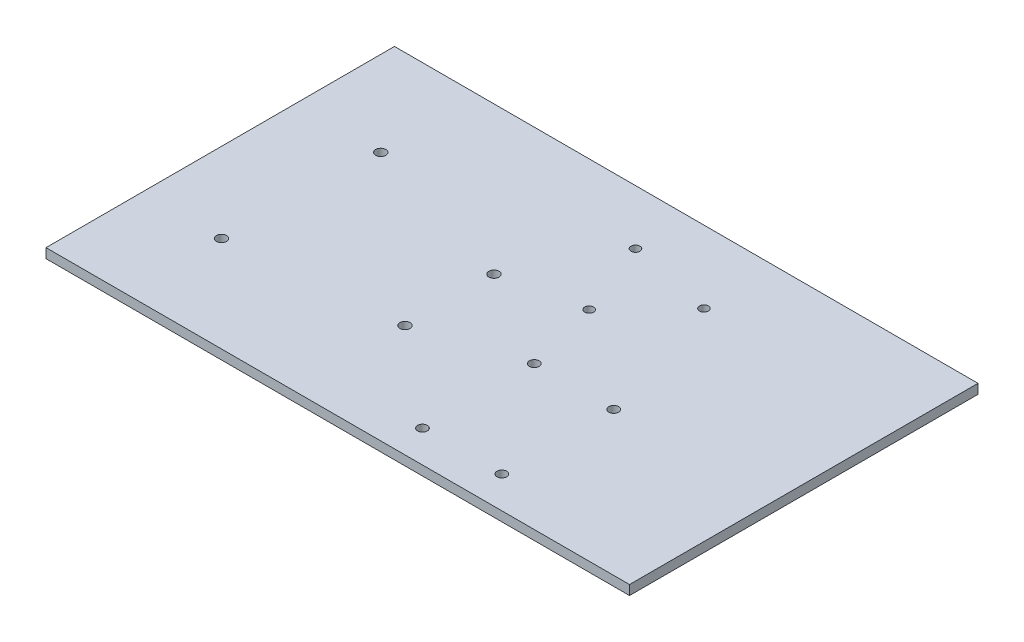
ISO-10303-21;
HEADER;
FILE_DESCRIPTION(('STEP AP214'),'2;1');
FILE_NAME('part.step','',(''),(''),'','','');
FILE_SCHEMA(('AUTOMOTIVE_DESIGN { 1 0 10303 214 1 1 1 1 }'));
ENDSEC;
DATA;
#1=APPLICATION_CONTEXT('core data for automotive mechanical design processes');
#2=APPLICATION_PROTOCOL_DEFINITION('international standard','automotive_design',2000,#1);
#3=PRODUCT_CONTEXT('',#1,'mechanical');
#4=PRODUCT('Part','Part','',(#3));
#5=PRODUCT_RELATED_PRODUCT_CATEGORY('part','',(#4));
#6=PRODUCT_DEFINITION_FORMATION('','',#4);
#7=PRODUCT_DEFINITION_CONTEXT('part definition',#1,'design');
#8=PRODUCT_DEFINITION('design','',#6,#7);
#9=PRODUCT_DEFINITION_SHAPE('','',#8);
#10=(LENGTH_UNIT() NAMED_UNIT(*) SI_UNIT(.MILLI.,.METRE.));
#11=(NAMED_UNIT(*) PLANE_ANGLE_UNIT() SI_UNIT($,.RADIAN.));
#12=(NAMED_UNIT(*) SI_UNIT($,.STERADIAN.) SOLID_ANGLE_UNIT());
#13=UNCERTAINTY_MEASURE_WITH_UNIT(LENGTH_MEASURE(1.E-05),#10,'distance_accuracy_value','');
#14=(GEOMETRIC_REPRESENTATION_CONTEXT(3) GLOBAL_UNCERTAINTY_ASSIGNED_CONTEXT((#13)) GLOBAL_UNIT_ASSIGNED_CONTEXT((#10,
#11,#12)) REPRESENTATION_CONTEXT('',''));
#15=CARTESIAN_POINT('',(0.,0.,0.));
#16=DIRECTION('',(0.,0.,1.));
#17=DIRECTION('',(1.,0.,0.));
#18=AXIS2_PLACEMENT_3D('',#15,#16,#17);
#19=CARTESIAN_POINT('',(91.44,3.,-54.61));
#20=DIRECTION('',(-1.,0.,0.));
#21=DIRECTION('',(0.,0.,1.));
#22=AXIS2_PLACEMENT_3D('',#19,#20,#21);
#23=PLANE('',#22);
#24=DIRECTION('',(0.,0.,-1.));
#25=VECTOR('',#24,1.);
#26=CARTESIAN_POINT('',(91.44,0.,-54.61));
#27=LINE('',#26,#25);
#28=CARTESIAN_POINT('',(91.44,0.,54.61));
#29=VERTEX_POINT('',#28);
#30=CARTESIAN_POINT('',(91.44,0.,-54.61));
#31=VERTEX_POINT('',#30);
#32=EDGE_CURVE('E124',#29,#31,#27,.T.);
#33=ORIENTED_EDGE('',*,*,#32,.T.);
#34=DIRECTION('',(0.,-1.,0.));
#35=VECTOR('',#34,1.);
#36=CARTESIAN_POINT('',(91.44,3.,-54.61));
#37=LINE('',#36,#35);
#38=CARTESIAN_POINT('',(91.44,3.,-54.61));
#39=VERTEX_POINT('',#38);
#40=EDGE_CURVE('E13',#39,#31,#37,.T.);
#41=ORIENTED_EDGE('',*,*,#40,.F.);
#42=DIRECTION('',(0.,0.,-1.));
#43=VECTOR('',#42,1.);
#44=CARTESIAN_POINT('',(91.44,3.,-54.61));
#45=LINE('',#44,#43);
#46=CARTESIAN_POINT('',(91.44,3.,54.61));
#47=VERTEX_POINT('',#46);
#48=EDGE_CURVE('E107',#47,#39,#45,.T.);
#49=ORIENTED_EDGE('',*,*,#48,.F.);
#50=DIRECTION('',(0.,-1.,0.));
#51=VECTOR('',#50,1.);
#52=CARTESIAN_POINT('',(91.44,3.,54.61));
#53=LINE('',#52,#51);
#54=EDGE_CURVE('E120',#47,#29,#53,.T.);
#55=ORIENTED_EDGE('',*,*,#54,.T.);
#56=EDGE_LOOP('',(#33,#41,#49,#55));
#57=FACE_BOUND('',#56,.T.);
#58=ADVANCED_FACE('F53',(#57),#23,.F.);
#59=CARTESIAN_POINT('',(-91.44,3.,-54.61));
#60=DIRECTION('',(0.,0.,1.));
#61=DIRECTION('',(1.,0.,0.));
#62=AXIS2_PLACEMENT_3D('',#59,#60,#61);
#63=PLANE('',#62);
#64=DIRECTION('',(-1.,0.,0.));
#65=VECTOR('',#64,1.);
#66=CARTESIAN_POINT('',(-91.44,0.,-54.61));
#67=LINE('',#66,#65);
#68=CARTESIAN_POINT('',(-91.44,0.,-54.61));
#69=VERTEX_POINT('',#68);
#70=EDGE_CURVE('E112',#31,#69,#67,.T.);
#71=ORIENTED_EDGE('',*,*,#70,.T.);
#72=DIRECTION('',(0.,-1.,0.));
#73=VECTOR('',#72,1.);
#74=CARTESIAN_POINT('',(-91.44,3.,-54.61));
#75=LINE('',#74,#73);
#76=CARTESIAN_POINT('',(-91.44,3.,-54.61));
#77=VERTEX_POINT('',#76);
#78=EDGE_CURVE('E63',#77,#69,#75,.T.);
#79=ORIENTED_EDGE('',*,*,#78,.F.);
#80=DIRECTION('',(-1.,0.,0.));
#81=VECTOR('',#80,1.);
#82=CARTESIAN_POINT('',(-91.44,3.,-54.61));
#83=LINE('',#82,#81);
#84=EDGE_CURVE('E102',#39,#77,#83,.T.);
#85=ORIENTED_EDGE('',*,*,#84,.F.);
#86=ORIENTED_EDGE('',*,*,#40,.T.);
#87=EDGE_LOOP('',(#71,#79,#85,#86));
#88=FACE_BOUND('',#87,.T.);
#89=ADVANCED_FACE('F111',(#88),#63,.F.);
#90=CARTESIAN_POINT('',(-91.44,3.,-54.61));
#91=DIRECTION('',(1.,0.,0.));
#92=DIRECTION('',(0.,0.,-1.));
#93=AXIS2_PLACEMENT_3D('',#90,#91,#92);
#94=PLANE('',#93);
#95=DIRECTION('',(0.,0.,1.));
#96=VECTOR('',#95,1.);
#97=CARTESIAN_POINT('',(-91.44,0.,-54.61));
#98=LINE('',#97,#96);
#99=CARTESIAN_POINT('',(-91.44,0.,54.61));
#100=VERTEX_POINT('',#99);
#101=EDGE_CURVE('E89',#69,#100,#98,.T.);
#102=ORIENTED_EDGE('',*,*,#101,.T.);
#103=DIRECTION('',(0.,-1.,0.));
#104=VECTOR('',#103,1.);
#105=CARTESIAN_POINT('',(-91.44,3.,54.61));
#106=LINE('',#105,#104);
#107=CARTESIAN_POINT('',(-91.44,3.,54.61));
#108=VERTEX_POINT('',#107);
#109=EDGE_CURVE('E114',#108,#100,#106,.T.);
#110=ORIENTED_EDGE('',*,*,#109,.F.);
#111=DIRECTION('',(0.,0.,1.));
#112=VECTOR('',#111,1.);
#113=CARTESIAN_POINT('',(-91.44,3.,-54.61));
#114=LINE('',#113,#112);
#115=EDGE_CURVE('E105',#77,#108,#114,.T.);
#116=ORIENTED_EDGE('',*,*,#115,.F.);
#117=ORIENTED_EDGE('',*,*,#78,.T.);
#118=EDGE_LOOP('',(#102,#110,#116,#117));
#119=FACE_BOUND('',#118,.T.);
#120=ADVANCED_FACE('F116',(#119),#94,.F.);
#121=CARTESIAN_POINT('',(-91.44,3.,54.61));
#122=DIRECTION('',(0.,0.,-1.));
#123=DIRECTION('',(-1.,0.,0.));
#124=AXIS2_PLACEMENT_3D('',#121,#122,#123);
#125=PLANE('',#124);
#126=DIRECTION('',(1.,0.,0.));
#127=VECTOR('',#126,1.);
#128=CARTESIAN_POINT('',(-91.44,0.,54.61));
#129=LINE('',#128,#127);
#130=EDGE_CURVE('E95',#100,#29,#129,.T.);
#131=ORIENTED_EDGE('',*,*,#130,.T.);
#132=ORIENTED_EDGE('',*,*,#54,.F.);
#133=DIRECTION('',(1.,0.,0.));
#134=VECTOR('',#133,1.);
#135=CARTESIAN_POINT('',(-91.44,3.,54.61));
#136=LINE('',#135,#134);
#137=EDGE_CURVE('E72',#108,#47,#136,.T.);
#138=ORIENTED_EDGE('',*,*,#137,.F.);
#139=ORIENTED_EDGE('',*,*,#109,.T.);
#140=EDGE_LOOP('',(#131,#132,#138,#139));
#141=FACE_BOUND('',#140,.T.);
#142=ADVANCED_FACE('F191',(#141),#125,.F.);
#143=CARTESIAN_POINT('',(0.,3.,0.));
#144=DIRECTION('',(0.,1.,0.));
#145=DIRECTION('',(0.,0.,1.));
#146=AXIS2_PLACEMENT_3D('',#143,#144,#145);
#147=PLANE('',#146);
#148=CARTESIAN_POINT('',(41.44,3.,44.61));
#149=DIRECTION('',(0.,1.,0.));
#150=DIRECTION('',(0.,0.,1.));
#151=AXIS2_PLACEMENT_3D('',#148,#149,#150);
#152=CIRCLE('',#151,1.52499999999999);
#153=CARTESIAN_POINT('',(41.44,3.,46.135));
#154=VERTEX_POINT('',#153);
#155=EDGE_CURVE('E347',#154,#154,#152,.T.);
#156=ORIENTED_EDGE('',*,*,#155,.F.);
#157=EDGE_LOOP('',(#156));
#158=FACE_BOUND('',#157,.T.);
#159=CARTESIAN_POINT('',(16.55,3.,9.56));
#160=DIRECTION('',(0.,1.,0.));
#161=DIRECTION('',(0.,0.,1.));
#162=AXIS2_PLACEMENT_3D('',#159,#160,#161);
#163=CIRCLE('',#162,1.525);
#164=CARTESIAN_POINT('',(16.55,3.,11.085));
#165=VERTEX_POINT('',#164);
#166=EDGE_CURVE('E351',#165,#165,#163,.T.);
#167=ORIENTED_EDGE('',*,*,#166,.F.);
#168=EDGE_LOOP('',(#167));
#169=FACE_BOUND('',#168,.T.);
#170=CARTESIAN_POINT('',(41.44,3.,9.56));
#171=DIRECTION('',(0.,1.,0.));
#172=DIRECTION('',(0.,0.,1.));
#173=AXIS2_PLACEMENT_3D('',#170,#171,#172);
#174=CIRCLE('',#173,1.52499999999998);
#175=CARTESIAN_POINT('',(41.44,3.,11.085));
#176=VERTEX_POINT('',#175);
#177=EDGE_CURVE('E410',#176,#176,#174,.T.);
#178=ORIENTED_EDGE('',*,*,#177,.F.);
#179=EDGE_LOOP('',(#178));
#180=FACE_BOUND('',#179,.T.);
#181=CARTESIAN_POINT('',(16.55,3.,44.61));
#182=DIRECTION('',(0.,1.,0.));
#183=DIRECTION('',(0.,0.,1.));
#184=AXIS2_PLACEMENT_3D('',#181,#182,#183);
#185=CIRCLE('',#184,1.525);
#186=CARTESIAN_POINT('',(16.55,3.,46.135));
#187=VERTEX_POINT('',#186);
#188=EDGE_CURVE('E360',#187,#187,#185,.T.);
#189=ORIENTED_EDGE('',*,*,#188,.F.);
#190=EDGE_LOOP('',(#189));
#191=FACE_BOUND('',#190,.T.);
#192=CARTESIAN_POINT('',(10.4954307859294,3.,-13.69));
#193=DIRECTION('',(0.,1.,0.));
#194=DIRECTION('',(0.,0.,1.));
#195=AXIS2_PLACEMENT_3D('',#192,#193,#194);
#196=CIRCLE('',#195,1.39999719999992);
#197=CARTESIAN_POINT('',(10.4954307859294,3.,-12.2900028000001));
#198=VERTEX_POINT('',#197);
#199=EDGE_CURVE('E370',#198,#198,#196,.T.);
#200=ORIENTED_EDGE('',*,*,#199,.F.);
#201=EDGE_LOOP('',(#200));
#202=FACE_BOUND('',#201,.T.);
#203=CARTESIAN_POINT('',(28.18,3.,-31.98));
#204=DIRECTION('',(0.,1.,0.));
#205=DIRECTION('',(0.,0.,1.));
#206=AXIS2_PLACEMENT_3D('',#203,#204,#205);
#207=CIRCLE('',#206,1.39999719999999);
#208=CARTESIAN_POINT('',(28.18,3.,-30.5800028));
#209=VERTEX_POINT('',#208);
#210=EDGE_CURVE('E378',#209,#209,#207,.T.);
#211=ORIENTED_EDGE('',*,*,#210,.F.);
#212=EDGE_LOOP('',(#211));
#213=FACE_BOUND('',#212,.T.);
#214=CARTESIAN_POINT('',(1.23357352078024,3.,-37.47));
#215=DIRECTION('',(0.,1.,0.));
#216=DIRECTION('',(0.,0.,1.));
#217=AXIS2_PLACEMENT_3D('',#214,#215,#216);
#218=CIRCLE('',#217,1.39999719999992);
#219=CARTESIAN_POINT('',(1.23357352078024,3.,-36.0700028000001));
#220=VERTEX_POINT('',#219);
#221=EDGE_CURVE('E359',#220,#220,#218,.T.);
#222=ORIENTED_EDGE('',*,*,#221,.F.);
#223=EDGE_LOOP('',(#222));
#224=FACE_BOUND('',#223,.T.);
#225=CARTESIAN_POINT('',(-66.44,3.,24.61));
#226=DIRECTION('',(0.,1.,0.));
#227=DIRECTION('',(0.,0.,1.));
#228=AXIS2_PLACEMENT_3D('',#225,#226,#227);
#229=CIRCLE('',#228,1.6);
#230=CARTESIAN_POINT('',(-66.44,3.,26.21));
#231=VERTEX_POINT('',#230);
#232=EDGE_CURVE('E143',#231,#231,#229,.T.);
#233=ORIENTED_EDGE('',*,*,#232,.F.);
#234=EDGE_LOOP('',(#233));
#235=FACE_BOUND('',#234,.T.);
#236=CARTESIAN_POINT('',(-64.84,3.,-23.69));
#237=DIRECTION('',(0.,1.,0.));
#238=DIRECTION('',(0.,0.,1.));
#239=AXIS2_PLACEMENT_3D('',#236,#237,#238);
#240=CIRCLE('',#239,1.6);
#241=CARTESIAN_POINT('',(-64.84,3.,-22.09));
#242=VERTEX_POINT('',#241);
#243=EDGE_CURVE('E391',#242,#242,#240,.T.);
#244=ORIENTED_EDGE('',*,*,#243,.F.);
#245=EDGE_LOOP('',(#244));
#246=FACE_BOUND('',#245,.T.);
#247=CARTESIAN_POINT('',(-14.04,3.,-8.39));
#248=DIRECTION('',(0.,1.,0.));
#249=DIRECTION('',(0.,0.,1.));
#250=AXIS2_PLACEMENT_3D('',#247,#248,#249);
#251=CIRCLE('',#250,1.6);
#252=CARTESIAN_POINT('',(-14.04,3.,-6.79));
#253=VERTEX_POINT('',#252);
#254=EDGE_CURVE('E395',#253,#253,#251,.T.);
#255=ORIENTED_EDGE('',*,*,#254,.F.);
#256=EDGE_LOOP('',(#255));
#257=FACE_BOUND('',#256,.T.);
#258=CARTESIAN_POINT('',(-14.04,3.,19.51));
#259=DIRECTION('',(0.,1.,0.));
#260=DIRECTION('',(0.,0.,1.));
#261=AXIS2_PLACEMENT_3D('',#258,#259,#260);
#262=CIRCLE('',#261,1.6);
#263=CARTESIAN_POINT('',(-14.04,3.,21.11));
#264=VERTEX_POINT('',#263);
#265=EDGE_CURVE('E369',#264,#264,#262,.T.);
#266=ORIENTED_EDGE('',*,*,#265,.F.);
#267=EDGE_LOOP('',(#266));
#268=FACE_BOUND('',#267,.T.);
#269=ORIENTED_EDGE('',*,*,#48,.T.);
#270=ORIENTED_EDGE('',*,*,#84,.T.);
#271=ORIENTED_EDGE('',*,*,#115,.T.);
#272=ORIENTED_EDGE('',*,*,#137,.T.);
#273=EDGE_LOOP('',(#269,#270,#271,#272));
#274=FACE_BOUND('',#273,.T.);
#275=ADVANCED_FACE('F103',(#158,#169,#180,#191,#202,#213,#224,#235,#246,#257,#268,#274),#147,.T.);
#276=CARTESIAN_POINT('',(0.,0.,0.));
#277=DIRECTION('',(0.,1.,0.));
#278=DIRECTION('',(0.,0.,1.));
#279=AXIS2_PLACEMENT_3D('',#276,#277,#278);
#280=PLANE('',#279);
#281=CARTESIAN_POINT('',(41.44,0.,44.61));
#282=DIRECTION('',(0.,1.,0.));
#283=DIRECTION('',(0.,0.,1.));
#284=AXIS2_PLACEMENT_3D('',#281,#282,#283);
#285=CIRCLE('',#284,1.52499999999999);
#286=CARTESIAN_POINT('',(41.44,0.,46.135));
#287=VERTEX_POINT('',#286);
#288=EDGE_CURVE('E344',#287,#287,#285,.T.);
#289=ORIENTED_EDGE('',*,*,#288,.T.);
#290=EDGE_LOOP('',(#289));
#291=FACE_BOUND('',#290,.T.);
#292=CARTESIAN_POINT('',(16.55,0.,9.56));
#293=DIRECTION('',(0.,1.,0.));
#294=DIRECTION('',(0.,0.,1.));
#295=AXIS2_PLACEMENT_3D('',#292,#293,#294);
#296=CIRCLE('',#295,1.525);
#297=CARTESIAN_POINT('',(16.55,0.,11.085));
#298=VERTEX_POINT('',#297);
#299=EDGE_CURVE('E414',#298,#298,#296,.T.);
#300=ORIENTED_EDGE('',*,*,#299,.T.);
#301=EDGE_LOOP('',(#300));
#302=FACE_BOUND('',#301,.T.);
#303=CARTESIAN_POINT('',(41.44,0.,9.56));
#304=DIRECTION('',(0.,1.,0.));
#305=DIRECTION('',(0.,0.,1.));
#306=AXIS2_PLACEMENT_3D('',#303,#304,#305);
#307=CIRCLE('',#306,1.52499999999998);
#308=CARTESIAN_POINT('',(41.44,0.,11.085));
#309=VERTEX_POINT('',#308);
#310=EDGE_CURVE('E364',#309,#309,#307,.T.);
#311=ORIENTED_EDGE('',*,*,#310,.T.);
#312=EDGE_LOOP('',(#311));
#313=FACE_BOUND('',#312,.T.);
#314=CARTESIAN_POINT('',(16.55,0.,44.61));
#315=DIRECTION('',(0.,1.,0.));
#316=DIRECTION('',(0.,0.,1.));
#317=AXIS2_PLACEMENT_3D('',#314,#315,#316);
#318=CIRCLE('',#317,1.525);
#319=CARTESIAN_POINT('',(16.55,0.,46.135));
#320=VERTEX_POINT('',#319);
#321=EDGE_CURVE('E355',#320,#320,#318,.T.);
#322=ORIENTED_EDGE('',*,*,#321,.T.);
#323=EDGE_LOOP('',(#322));
#324=FACE_BOUND('',#323,.T.);
#325=CARTESIAN_POINT('',(10.4954307859294,0.,-13.69));
#326=DIRECTION('',(0.,1.,0.));
#327=DIRECTION('',(0.,0.,1.));
#328=AXIS2_PLACEMENT_3D('',#325,#326,#327);
#329=CIRCLE('',#328,1.39999719999992);
#330=CARTESIAN_POINT('',(10.4954307859294,0.,-12.2900028000001));
#331=VERTEX_POINT('',#330);
#332=EDGE_CURVE('E365',#331,#331,#329,.T.);
#333=ORIENTED_EDGE('',*,*,#332,.T.);
#334=EDGE_LOOP('',(#333));
#335=FACE_BOUND('',#334,.T.);
#336=CARTESIAN_POINT('',(28.18,0.,-31.98));
#337=DIRECTION('',(0.,1.,0.));
#338=DIRECTION('',(0.,0.,1.));
#339=AXIS2_PLACEMENT_3D('',#336,#337,#338);
#340=CIRCLE('',#339,1.39999719999999);
#341=CARTESIAN_POINT('',(28.18,0.,-30.5800028));
#342=VERTEX_POINT('',#341);
#343=EDGE_CURVE('E374',#342,#342,#340,.T.);
#344=ORIENTED_EDGE('',*,*,#343,.T.);
#345=EDGE_LOOP('',(#344));
#346=FACE_BOUND('',#345,.T.);
#347=CARTESIAN_POINT('',(1.23357352078024,0.,-37.47));
#348=DIRECTION('',(0.,1.,0.));
#349=DIRECTION('',(0.,0.,1.));
#350=AXIS2_PLACEMENT_3D('',#347,#348,#349);
#351=CIRCLE('',#350,1.39999719999992);
#352=CARTESIAN_POINT('',(1.23357352078024,0.,-36.0700028000001));
#353=VERTEX_POINT('',#352);
#354=EDGE_CURVE('E382',#353,#353,#351,.T.);
#355=ORIENTED_EDGE('',*,*,#354,.T.);
#356=EDGE_LOOP('',(#355));
#357=FACE_BOUND('',#356,.T.);
#358=CARTESIAN_POINT('',(-66.44,0.,24.61));
#359=DIRECTION('',(0.,1.,0.));
#360=DIRECTION('',(0.,0.,1.));
#361=AXIS2_PLACEMENT_3D('',#358,#359,#360);
#362=CIRCLE('',#361,1.6);
#363=CARTESIAN_POINT('',(-66.44,0.,26.21));
#364=VERTEX_POINT('',#363);
#365=EDGE_CURVE('E56',#364,#364,#362,.T.);
#366=ORIENTED_EDGE('',*,*,#365,.T.);
#367=EDGE_LOOP('',(#366));
#368=FACE_BOUND('',#367,.T.);
#369=CARTESIAN_POINT('',(-64.84,0.,-23.69));
#370=DIRECTION('',(0.,1.,0.));
#371=DIRECTION('',(0.,0.,1.));
#372=AXIS2_PLACEMENT_3D('',#369,#370,#371);
#373=CIRCLE('',#372,1.6);
#374=CARTESIAN_POINT('',(-64.84,0.,-22.09));
#375=VERTEX_POINT('',#374);
#376=EDGE_CURVE('E146',#375,#375,#373,.T.);
#377=ORIENTED_EDGE('',*,*,#376,.T.);
#378=EDGE_LOOP('',(#377));
#379=FACE_BOUND('',#378,.T.);
#380=CARTESIAN_POINT('',(-14.04,0.,-8.39));
#381=DIRECTION('',(0.,1.,0.));
#382=DIRECTION('',(0.,0.,1.));
#383=AXIS2_PLACEMENT_3D('',#380,#381,#382);
#384=CIRCLE('',#383,1.6);
#385=CARTESIAN_POINT('',(-14.04,0.,-6.79));
#386=VERTEX_POINT('',#385);
#387=EDGE_CURVE('E142',#386,#386,#384,.T.);
#388=ORIENTED_EDGE('',*,*,#387,.T.);
#389=EDGE_LOOP('',(#388));
#390=FACE_BOUND('',#389,.T.);
#391=CARTESIAN_POINT('',(-14.04,0.,19.51));
#392=DIRECTION('',(0.,1.,0.));
#393=DIRECTION('',(0.,0.,1.));
#394=AXIS2_PLACEMENT_3D('',#391,#392,#393);
#395=CIRCLE('',#394,1.6);
#396=CARTESIAN_POINT('',(-14.04,0.,21.11));
#397=VERTEX_POINT('',#396);
#398=EDGE_CURVE('E138',#397,#397,#395,.T.);
#399=ORIENTED_EDGE('',*,*,#398,.T.);
#400=EDGE_LOOP('',(#399));
#401=FACE_BOUND('',#400,.T.);
#402=ORIENTED_EDGE('',*,*,#32,.F.);
#403=ORIENTED_EDGE('',*,*,#130,.F.);
#404=ORIENTED_EDGE('',*,*,#101,.F.);
#405=ORIENTED_EDGE('',*,*,#70,.F.);
#406=EDGE_LOOP('',(#402,#403,#404,#405));
#407=FACE_BOUND('',#406,.T.);
#408=ADVANCED_FACE('F155',(#291,#302,#313,#324,#335,#346,#357,#368,#379,#390,#401,#407),#280,.F.);
#409=CARTESIAN_POINT('',(-14.04,-7.,19.51));
#410=DIRECTION('',(0.,1.,0.));
#411=DIRECTION('',(0.,0.,1.));
#412=AXIS2_PLACEMENT_3D('',#409,#410,#411);
#413=CYLINDRICAL_SURFACE('',#412,1.6);
#414=ORIENTED_EDGE('',*,*,#265,.T.);
#415=EDGE_LOOP('',(#414));
#416=FACE_BOUND('',#415,.T.);
#417=ORIENTED_EDGE('',*,*,#398,.F.);
#418=EDGE_LOOP('',(#417));
#419=FACE_BOUND('',#418,.T.);
#420=ADVANCED_FACE('F182',(#416,#419),#413,.F.);
#421=CARTESIAN_POINT('',(-14.04,-7.,-8.39));
#422=DIRECTION('',(0.,1.,0.));
#423=DIRECTION('',(0.,0.,1.));
#424=AXIS2_PLACEMENT_3D('',#421,#422,#423);
#425=CYLINDRICAL_SURFACE('',#424,1.6);
#426=ORIENTED_EDGE('',*,*,#254,.T.);
#427=EDGE_LOOP('',(#426));
#428=FACE_BOUND('',#427,.T.);
#429=ORIENTED_EDGE('',*,*,#387,.F.);
#430=EDGE_LOOP('',(#429));
#431=FACE_BOUND('',#430,.T.);
#432=ADVANCED_FACE('F170',(#428,#431),#425,.F.);
#433=CARTESIAN_POINT('',(-64.84,-7.,-23.69));
#434=DIRECTION('',(0.,1.,0.));
#435=DIRECTION('',(0.,0.,1.));
#436=AXIS2_PLACEMENT_3D('',#433,#434,#435);
#437=CYLINDRICAL_SURFACE('',#436,1.6);
#438=ORIENTED_EDGE('',*,*,#243,.T.);
#439=EDGE_LOOP('',(#438));
#440=FACE_BOUND('',#439,.T.);
#441=ORIENTED_EDGE('',*,*,#376,.F.);
#442=EDGE_LOOP('',(#441));
#443=FACE_BOUND('',#442,.T.);
#444=ADVANCED_FACE('F160',(#440,#443),#437,.F.);
#445=CARTESIAN_POINT('',(-66.44,-7.,24.61));
#446=DIRECTION('',(0.,1.,0.));
#447=DIRECTION('',(0.,0.,1.));
#448=AXIS2_PLACEMENT_3D('',#445,#446,#447);
#449=CYLINDRICAL_SURFACE('',#448,1.6);
#450=ORIENTED_EDGE('',*,*,#232,.T.);
#451=EDGE_LOOP('',(#450));
#452=FACE_BOUND('',#451,.T.);
#453=ORIENTED_EDGE('',*,*,#365,.F.);
#454=EDGE_LOOP('',(#453));
#455=FACE_BOUND('',#454,.T.);
#456=ADVANCED_FACE('F157',(#452,#455),#449,.F.);
#457=CARTESIAN_POINT('',(1.23357352078024,0.,-37.47));
#458=DIRECTION('',(0.,1.,0.));
#459=DIRECTION('',(0.,0.,1.));
#460=AXIS2_PLACEMENT_3D('',#457,#458,#459);
#461=CYLINDRICAL_SURFACE('',#460,1.39999719999992);
#462=ORIENTED_EDGE('',*,*,#354,.F.);
#463=EDGE_LOOP('',(#462));
#464=FACE_BOUND('',#463,.T.);
#465=ORIENTED_EDGE('',*,*,#221,.T.);
#466=EDGE_LOOP('',(#465));
#467=FACE_BOUND('',#466,.T.);
#468=ADVANCED_FACE('F159',(#464,#467),#461,.F.);
#469=CARTESIAN_POINT('',(28.18,0.,-31.98));
#470=DIRECTION('',(0.,1.,0.));
#471=DIRECTION('',(0.,0.,1.));
#472=AXIS2_PLACEMENT_3D('',#469,#470,#471);
#473=CYLINDRICAL_SURFACE('',#472,1.39999719999999);
#474=ORIENTED_EDGE('',*,*,#343,.F.);
#475=EDGE_LOOP('',(#474));
#476=FACE_BOUND('',#475,.T.);
#477=ORIENTED_EDGE('',*,*,#210,.T.);
#478=EDGE_LOOP('',(#477));
#479=FACE_BOUND('',#478,.T.);
#480=ADVANCED_FACE('F167',(#476,#479),#473,.F.);
#481=CARTESIAN_POINT('',(10.4954307859294,0.,-13.69));
#482=DIRECTION('',(0.,1.,0.));
#483=DIRECTION('',(0.,0.,1.));
#484=AXIS2_PLACEMENT_3D('',#481,#482,#483);
#485=CYLINDRICAL_SURFACE('',#484,1.39999719999992);
#486=ORIENTED_EDGE('',*,*,#332,.F.);
#487=EDGE_LOOP('',(#486));
#488=FACE_BOUND('',#487,.T.);
#489=ORIENTED_EDGE('',*,*,#199,.T.);
#490=EDGE_LOOP('',(#489));
#491=FACE_BOUND('',#490,.T.);
#492=ADVANCED_FACE('F290',(#488,#491),#485,.F.);
#493=CARTESIAN_POINT('',(16.55,0.,44.61));
#494=DIRECTION('',(0.,1.,0.));
#495=DIRECTION('',(0.,0.,1.));
#496=AXIS2_PLACEMENT_3D('',#493,#494,#495);
#497=CYLINDRICAL_SURFACE('',#496,1.525);
#498=ORIENTED_EDGE('',*,*,#321,.F.);
#499=EDGE_LOOP('',(#498));
#500=FACE_BOUND('',#499,.T.);
#501=ORIENTED_EDGE('',*,*,#188,.T.);
#502=EDGE_LOOP('',(#501));
#503=FACE_BOUND('',#502,.T.);
#504=ADVANCED_FACE('F298',(#500,#503),#497,.F.);
#505=CARTESIAN_POINT('',(41.44,0.,9.56));
#506=DIRECTION('',(0.,1.,0.));
#507=DIRECTION('',(0.,0.,1.));
#508=AXIS2_PLACEMENT_3D('',#505,#506,#507);
#509=CYLINDRICAL_SURFACE('',#508,1.52499999999998);
#510=ORIENTED_EDGE('',*,*,#310,.F.);
#511=EDGE_LOOP('',(#510));
#512=FACE_BOUND('',#511,.T.);
#513=ORIENTED_EDGE('',*,*,#177,.T.);
#514=EDGE_LOOP('',(#513));
#515=FACE_BOUND('',#514,.T.);
#516=ADVANCED_FACE('F306',(#512,#515),#509,.F.);
#517=CARTESIAN_POINT('',(16.55,0.,9.56));
#518=DIRECTION('',(0.,1.,0.));
#519=DIRECTION('',(0.,0.,1.));
#520=AXIS2_PLACEMENT_3D('',#517,#518,#519);
#521=CYLINDRICAL_SURFACE('',#520,1.525);
#522=ORIENTED_EDGE('',*,*,#299,.F.);
#523=EDGE_LOOP('',(#522));
#524=FACE_BOUND('',#523,.T.);
#525=ORIENTED_EDGE('',*,*,#166,.T.);
#526=EDGE_LOOP('',(#525));
#527=FACE_BOUND('',#526,.T.);
#528=ADVANCED_FACE('F315',(#524,#527),#521,.F.);
#529=CARTESIAN_POINT('',(41.44,0.,44.61));
#530=DIRECTION('',(0.,1.,0.));
#531=DIRECTION('',(0.,0.,1.));
#532=AXIS2_PLACEMENT_3D('',#529,#530,#531);
#533=CYLINDRICAL_SURFACE('',#532,1.52499999999999);
#534=ORIENTED_EDGE('',*,*,#288,.F.);
#535=EDGE_LOOP('',(#534));
#536=FACE_BOUND('',#535,.T.);
#537=ORIENTED_EDGE('',*,*,#155,.T.);
#538=EDGE_LOOP('',(#537));
#539=FACE_BOUND('',#538,.T.);
#540=ADVANCED_FACE('F324',(#536,#539),#533,.F.);
#541=CLOSED_SHELL('',(#58,#89,#120,#142,#275,#408,#420,#432,#444,#456,#468,#480,#492,#504,#516,
#528,#540));
#542=MANIFOLD_SOLID_BREP('B2',#541);
#543=ADVANCED_BREP_SHAPE_REPRESENTATION('',(#18,#542),#14);
#544=SHAPE_DEFINITION_REPRESENTATION(#9,#543);
ENDSEC;
END-ISO-10303-21;
